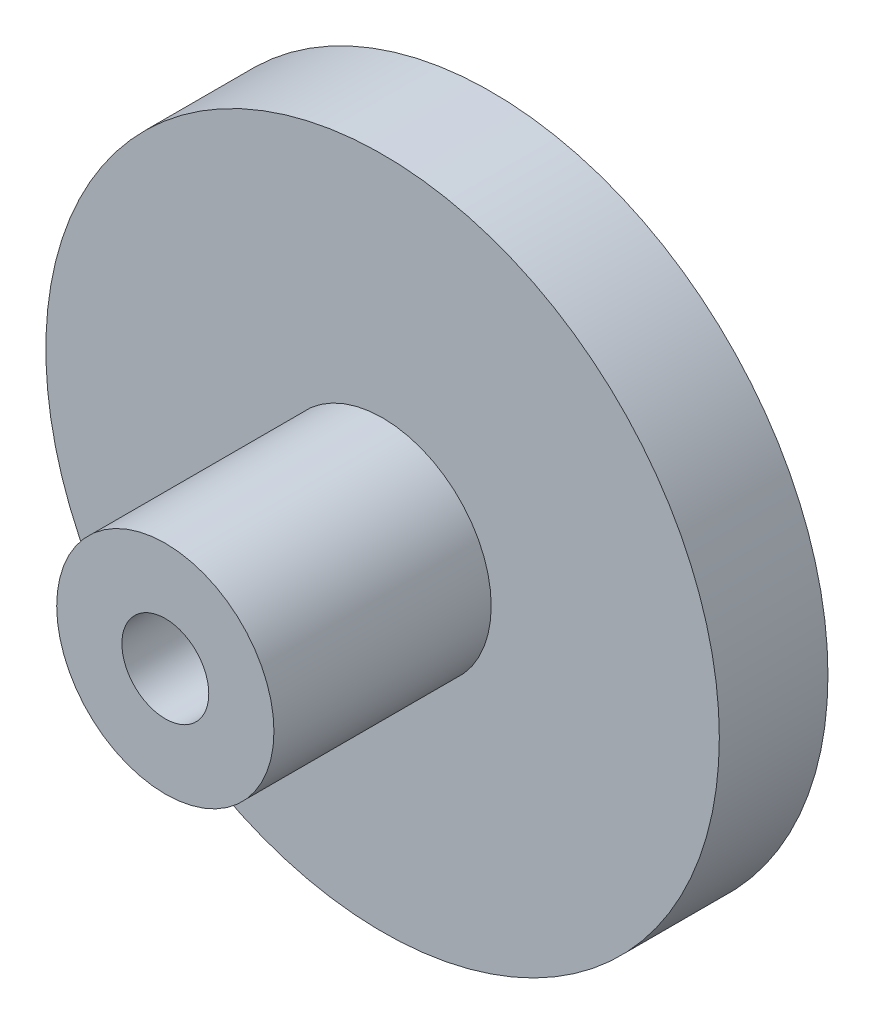
ISO-10303-21;
HEADER;
FILE_DESCRIPTION(('STEP AP214'),'2;1');
FILE_NAME('part.step','',(''),(''),'','','');
FILE_SCHEMA(('AUTOMOTIVE_DESIGN { 1 0 10303 214 1 1 1 1 }'));
ENDSEC;
DATA;
#1=APPLICATION_CONTEXT('core data for automotive mechanical design processes');
#2=APPLICATION_PROTOCOL_DEFINITION('international standard','automotive_design',2000,#1);
#3=PRODUCT_CONTEXT('',#1,'mechanical');
#4=PRODUCT('Part','Part','',(#3));
#5=PRODUCT_RELATED_PRODUCT_CATEGORY('part','',(#4));
#6=PRODUCT_DEFINITION_FORMATION('','',#4);
#7=PRODUCT_DEFINITION_CONTEXT('part definition',#1,'design');
#8=PRODUCT_DEFINITION('design','',#6,#7);
#9=PRODUCT_DEFINITION_SHAPE('','',#8);
#10=(LENGTH_UNIT() NAMED_UNIT(*) SI_UNIT(.MILLI.,.METRE.));
#11=(NAMED_UNIT(*) PLANE_ANGLE_UNIT() SI_UNIT($,.RADIAN.));
#12=(NAMED_UNIT(*) SI_UNIT($,.STERADIAN.) SOLID_ANGLE_UNIT());
#13=UNCERTAINTY_MEASURE_WITH_UNIT(LENGTH_MEASURE(1.E-05),#10,'distance_accuracy_value','');
#14=(GEOMETRIC_REPRESENTATION_CONTEXT(3) GLOBAL_UNCERTAINTY_ASSIGNED_CONTEXT((#13)) GLOBAL_UNIT_ASSIGNED_CONTEXT((#10,
#11,#12)) REPRESENTATION_CONTEXT('',''));
#15=CARTESIAN_POINT('',(0.,0.,0.));
#16=DIRECTION('',(0.,0.,1.));
#17=DIRECTION('',(1.,0.,0.));
#18=AXIS2_PLACEMENT_3D('',#15,#16,#17);
#19=CARTESIAN_POINT('',(0.,0.,5.));
#20=DIRECTION('',(0.,0.,-1.));
#21=DIRECTION('',(-1.,0.,0.));
#22=AXIS2_PLACEMENT_3D('',#19,#20,#21);
#23=CYLINDRICAL_SURFACE('',#22,15.5);
#24=CARTESIAN_POINT('',(0.,0.,5.));
#25=DIRECTION('',(0.,0.,1.));
#26=DIRECTION('',(1.,0.,0.));
#27=AXIS2_PLACEMENT_3D('',#24,#25,#26);
#28=CIRCLE('',#27,15.5);
#29=CARTESIAN_POINT('',(15.5,0.,5.));
#30=VERTEX_POINT('',#29);
#31=EDGE_CURVE('E42',#30,#30,#28,.T.);
#32=ORIENTED_EDGE('',*,*,#31,.F.);
#33=EDGE_LOOP('',(#32));
#34=FACE_BOUND('',#33,.T.);
#35=CARTESIAN_POINT('',(0.,0.,0.));
#36=DIRECTION('',(0.,0.,1.));
#37=DIRECTION('',(1.,0.,0.));
#38=AXIS2_PLACEMENT_3D('',#35,#36,#37);
#39=CIRCLE('',#38,15.5);
#40=CARTESIAN_POINT('',(15.5,0.,0.));
#41=VERTEX_POINT('',#40);
#42=EDGE_CURVE('E38',#41,#41,#39,.T.);
#43=ORIENTED_EDGE('',*,*,#42,.T.);
#44=EDGE_LOOP('',(#43));
#45=FACE_BOUND('',#44,.T.);
#46=ADVANCED_FACE('F35',(#34,#45),#23,.T.);
#47=CARTESIAN_POINT('',(0.,0.,5.));
#48=DIRECTION('',(0.,0.,1.));
#49=DIRECTION('',(1.,0.,0.));
#50=AXIS2_PLACEMENT_3D('',#47,#48,#49);
#51=PLANE('',#50);
#52=CARTESIAN_POINT('',(0.,0.,5.));
#53=DIRECTION('',(0.,0.,1.));
#54=DIRECTION('',(1.,0.,0.));
#55=AXIS2_PLACEMENT_3D('',#52,#53,#54);
#56=CIRCLE('',#55,5.);
#57=CARTESIAN_POINT('',(5.,0.,5.));
#58=VERTEX_POINT('',#57);
#59=EDGE_CURVE('E10',#58,#58,#56,.T.);
#60=ORIENTED_EDGE('',*,*,#59,.F.);
#61=EDGE_LOOP('',(#60));
#62=FACE_BOUND('',#61,.T.);
#63=ORIENTED_EDGE('',*,*,#31,.T.);
#64=EDGE_LOOP('',(#63));
#65=FACE_BOUND('',#64,.T.);
#66=ADVANCED_FACE('F79',(#62,#65),#51,.T.);
#67=CARTESIAN_POINT('',(0.,0.,0.));
#68=DIRECTION('',(0.,0.,1.));
#69=DIRECTION('',(1.,0.,0.));
#70=AXIS2_PLACEMENT_3D('',#67,#68,#69);
#71=PLANE('',#70);
#72=ORIENTED_EDGE('',*,*,#42,.F.);
#73=EDGE_LOOP('',(#72));
#74=FACE_BOUND('',#73,.T.);
#75=ADVANCED_FACE('F74',(#74),#71,.F.);
#76=CARTESIAN_POINT('',(0.,0.,15.));
#77=DIRECTION('',(0.,0.,-1.));
#78=DIRECTION('',(-1.,0.,0.));
#79=AXIS2_PLACEMENT_3D('',#76,#77,#78);
#80=CYLINDRICAL_SURFACE('',#79,5.);
#81=CARTESIAN_POINT('',(0.,0.,15.));
#82=DIRECTION('',(0.,0.,1.));
#83=DIRECTION('',(1.,0.,0.));
#84=AXIS2_PLACEMENT_3D('',#81,#82,#83);
#85=CIRCLE('',#84,5.);
#86=CARTESIAN_POINT('',(5.,0.,15.));
#87=VERTEX_POINT('',#86);
#88=EDGE_CURVE('E48',#87,#87,#85,.T.);
#89=ORIENTED_EDGE('',*,*,#88,.F.);
#90=EDGE_LOOP('',(#89));
#91=FACE_BOUND('',#90,.T.);
#92=ORIENTED_EDGE('',*,*,#59,.T.);
#93=EDGE_LOOP('',(#92));
#94=FACE_BOUND('',#93,.T.);
#95=ADVANCED_FACE('F69',(#91,#94),#80,.T.);
#96=CARTESIAN_POINT('',(0.,0.,15.));
#97=DIRECTION('',(0.,0.,1.));
#98=DIRECTION('',(1.,0.,0.));
#99=AXIS2_PLACEMENT_3D('',#96,#97,#98);
#100=PLANE('',#99);
#101=CARTESIAN_POINT('',(0.,0.,15.));
#102=DIRECTION('',(0.,0.,1.));
#103=DIRECTION('',(1.,0.,0.));
#104=AXIS2_PLACEMENT_3D('',#101,#102,#103);
#105=CIRCLE('',#104,2.);
#106=CARTESIAN_POINT('',(2.,0.,15.));
#107=VERTEX_POINT('',#106);
#108=EDGE_CURVE('E52',#107,#107,#105,.T.);
#109=ORIENTED_EDGE('',*,*,#108,.F.);
#110=EDGE_LOOP('',(#109));
#111=FACE_BOUND('',#110,.T.);
#112=ORIENTED_EDGE('',*,*,#88,.T.);
#113=EDGE_LOOP('',(#112));
#114=FACE_BOUND('',#113,.T.);
#115=ADVANCED_FACE('F63',(#111,#114),#100,.T.);
#116=CARTESIAN_POINT('',(0.,0.,12.));
#117=DIRECTION('',(0.,0.,1.));
#118=DIRECTION('',(1.,0.,0.));
#119=AXIS2_PLACEMENT_3D('',#116,#117,#118);
#120=CYLINDRICAL_SURFACE('',#119,2.);
#121=CARTESIAN_POINT('',(0.,0.,12.));
#122=DIRECTION('',(0.,0.,1.));
#123=DIRECTION('',(1.,0.,0.));
#124=AXIS2_PLACEMENT_3D('',#121,#122,#123);
#125=CIRCLE('',#124,2.);
#126=CARTESIAN_POINT('',(2.,0.,12.));
#127=VERTEX_POINT('',#126);
#128=EDGE_CURVE('E51',#127,#127,#125,.T.);
#129=ORIENTED_EDGE('',*,*,#128,.F.);
#130=EDGE_LOOP('',(#129));
#131=FACE_BOUND('',#130,.T.);
#132=ORIENTED_EDGE('',*,*,#108,.T.);
#133=EDGE_LOOP('',(#132));
#134=FACE_BOUND('',#133,.T.);
#135=ADVANCED_FACE('F60',(#131,#134),#120,.F.);
#136=CARTESIAN_POINT('',(0.,0.,12.));
#137=DIRECTION('',(0.,0.,1.));
#138=DIRECTION('',(1.,0.,0.));
#139=AXIS2_PLACEMENT_3D('',#136,#137,#138);
#140=PLANE('',#139);
#141=ORIENTED_EDGE('',*,*,#128,.T.);
#142=EDGE_LOOP('',(#141));
#143=FACE_BOUND('',#142,.T.);
#144=ADVANCED_FACE('F58',(#143),#140,.T.);
#145=CLOSED_SHELL('',(#46,#66,#75,#95,#115,#135,#144));
#146=MANIFOLD_SOLID_BREP('B2',#145);
#147=ADVANCED_BREP_SHAPE_REPRESENTATION('',(#18,#146),#14);
#148=SHAPE_DEFINITION_REPRESENTATION(#9,#147);
ENDSEC;
END-ISO-10303-21;
